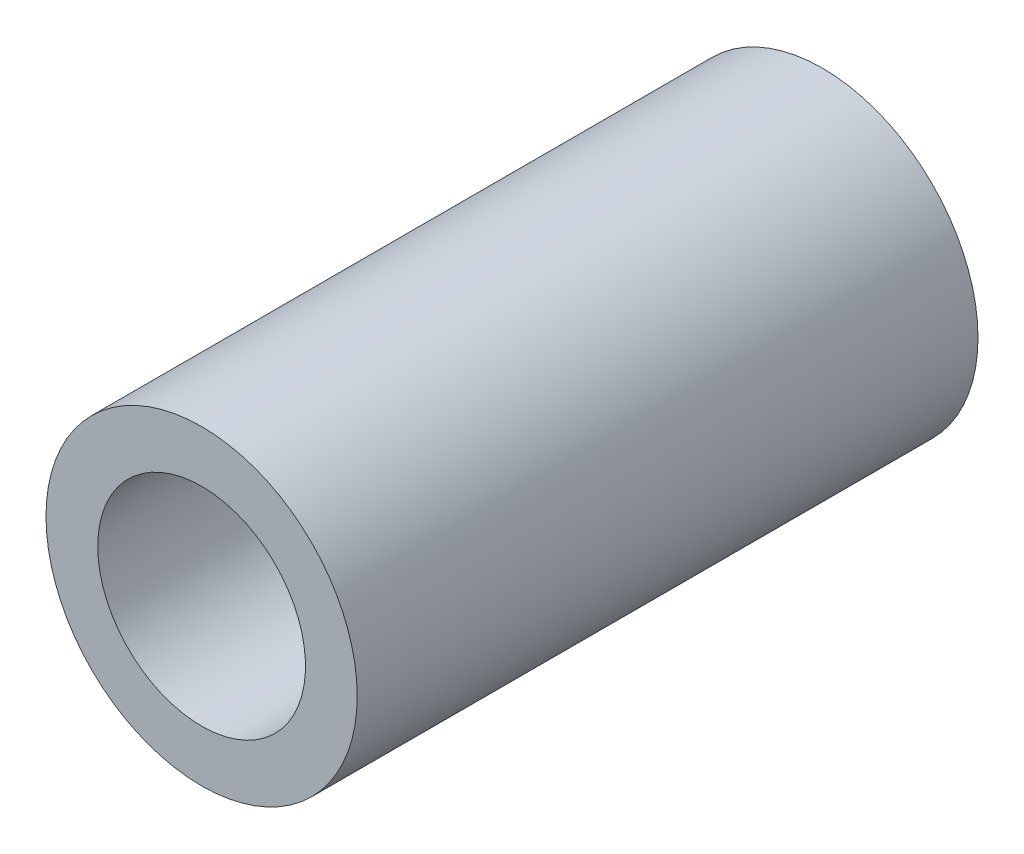
ISO-10303-21;
HEADER;
FILE_DESCRIPTION(('STEP AP214'),'2;1');
FILE_NAME('part.step','',(''),(''),'','','');
FILE_SCHEMA(('AUTOMOTIVE_DESIGN { 1 0 10303 214 1 1 1 1 }'));
ENDSEC;
DATA;
#1=APPLICATION_CONTEXT('core data for automotive mechanical design processes');
#2=APPLICATION_PROTOCOL_DEFINITION('international standard','automotive_design',2000,#1);
#3=PRODUCT_CONTEXT('',#1,'mechanical');
#4=PRODUCT('Part','Part','',(#3));
#5=PRODUCT_RELATED_PRODUCT_CATEGORY('part','',(#4));
#6=PRODUCT_DEFINITION_FORMATION('','',#4);
#7=PRODUCT_DEFINITION_CONTEXT('part definition',#1,'design');
#8=PRODUCT_DEFINITION('design','',#6,#7);
#9=PRODUCT_DEFINITION_SHAPE('','',#8);
#10=(LENGTH_UNIT() NAMED_UNIT(*) SI_UNIT(.MILLI.,.METRE.));
#11=(NAMED_UNIT(*) PLANE_ANGLE_UNIT() SI_UNIT($,.RADIAN.));
#12=(NAMED_UNIT(*) SI_UNIT($,.STERADIAN.) SOLID_ANGLE_UNIT());
#13=UNCERTAINTY_MEASURE_WITH_UNIT(LENGTH_MEASURE(1.E-05),#10,'distance_accuracy_value','');
#14=(GEOMETRIC_REPRESENTATION_CONTEXT(3) GLOBAL_UNCERTAINTY_ASSIGNED_CONTEXT((#13)) GLOBAL_UNIT_ASSIGNED_CONTEXT((#10,
#11,#12)) REPRESENTATION_CONTEXT('',''));
#15=CARTESIAN_POINT('',(0.,0.,0.));
#16=DIRECTION('',(0.,0.,1.));
#17=DIRECTION('',(1.,0.,0.));
#18=AXIS2_PLACEMENT_3D('',#15,#16,#17);
#19=CARTESIAN_POINT('',(0.,0.,19.05));
#20=DIRECTION('',(0.,0.,1.));
#21=DIRECTION('',(1.,0.,0.));
#22=AXIS2_PLACEMENT_3D('',#19,#20,#21);
#23=PLANE('',#22);
#24=CARTESIAN_POINT('',(0.,0.,19.05));
#25=DIRECTION('',(0.,0.,1.));
#26=DIRECTION('',(1.,0.,0.));
#27=AXIS2_PLACEMENT_3D('',#24,#25,#26);
#28=CIRCLE('',#27,9.5504);
#29=CARTESIAN_POINT('',(-9.5504,0.,19.05));
#30=VERTEX_POINT('',#29);
#31=EDGE_CURVE('E10',#30,#30,#28,.T.);
#32=ORIENTED_EDGE('',*,*,#31,.T.);
#33=EDGE_LOOP('',(#32));
#34=FACE_BOUND('',#33,.T.);
#35=CARTESIAN_POINT('',(0.,0.,19.05));
#36=DIRECTION('',(0.,0.,1.));
#37=DIRECTION('',(1.,0.,0.));
#38=AXIS2_PLACEMENT_3D('',#35,#36,#37);
#39=CIRCLE('',#38,6.3754);
#40=CARTESIAN_POINT('',(-6.3754,0.,19.05));
#41=VERTEX_POINT('',#40);
#42=EDGE_CURVE('E41',#41,#41,#39,.T.);
#43=ORIENTED_EDGE('',*,*,#42,.F.);
#44=EDGE_LOOP('',(#43));
#45=FACE_BOUND('',#44,.T.);
#46=ADVANCED_FACE('F30',(#34,#45),#23,.T.);
#47=CARTESIAN_POINT('',(0.,0.,-19.05));
#48=DIRECTION('',(0.,0.,1.));
#49=DIRECTION('',(1.,0.,0.));
#50=AXIS2_PLACEMENT_3D('',#47,#48,#49);
#51=PLANE('',#50);
#52=CARTESIAN_POINT('',(0.,0.,-19.05));
#53=DIRECTION('',(0.,0.,1.));
#54=DIRECTION('',(1.,0.,0.));
#55=AXIS2_PLACEMENT_3D('',#52,#53,#54);
#56=CIRCLE('',#55,9.5504);
#57=CARTESIAN_POINT('',(-9.5504,0.,-19.05));
#58=VERTEX_POINT('',#57);
#59=EDGE_CURVE('E34',#58,#58,#56,.T.);
#60=ORIENTED_EDGE('',*,*,#59,.F.);
#61=EDGE_LOOP('',(#60));
#62=FACE_BOUND('',#61,.T.);
#63=CARTESIAN_POINT('',(0.,0.,-19.05));
#64=DIRECTION('',(0.,0.,1.));
#65=DIRECTION('',(1.,0.,0.));
#66=AXIS2_PLACEMENT_3D('',#63,#64,#65);
#67=CIRCLE('',#66,6.3754);
#68=CARTESIAN_POINT('',(-6.3754,0.,-19.05));
#69=VERTEX_POINT('',#68);
#70=EDGE_CURVE('E43',#69,#69,#67,.T.);
#71=ORIENTED_EDGE('',*,*,#70,.T.);
#72=EDGE_LOOP('',(#71));
#73=FACE_BOUND('',#72,.T.);
#74=ADVANCED_FACE('F53',(#62,#73),#51,.F.);
#75=CARTESIAN_POINT('',(0.,0.,19.05));
#76=DIRECTION('',(0.,0.,-1.));
#77=DIRECTION('',(-1.,0.,0.));
#78=AXIS2_PLACEMENT_3D('',#75,#76,#77);
#79=CYLINDRICAL_SURFACE('',#78,9.5504);
#80=CARTESIAN_POINT('',(-9.5504,0.,19.05));
#81=CARTESIAN_POINT('',(-9.5504,0.,18.653125));
#82=CARTESIAN_POINT('',(-9.5504,0.,18.25625));
#83=CARTESIAN_POINT('',(-9.5504,0.,17.4625));
#84=CARTESIAN_POINT('',(-9.5504,0.,17.065625));
#85=CARTESIAN_POINT('',(-9.5504,0.,16.271875));
#86=CARTESIAN_POINT('',(-9.5504,0.,15.875));
#87=CARTESIAN_POINT('',(-9.5504,0.,15.08125));
#88=CARTESIAN_POINT('',(-9.5504,0.,14.684375));
#89=CARTESIAN_POINT('',(-9.5504,0.,13.890625));
#90=CARTESIAN_POINT('',(-9.5504,0.,13.49375));
#91=CARTESIAN_POINT('',(-9.5504,0.,12.7));
#92=CARTESIAN_POINT('',(-9.5504,0.,12.303125));
#93=CARTESIAN_POINT('',(-9.5504,0.,11.509375));
#94=CARTESIAN_POINT('',(-9.5504,0.,11.1125));
#95=CARTESIAN_POINT('',(-9.5504,0.,10.31875));
#96=CARTESIAN_POINT('',(-9.5504,0.,9.921875));
#97=CARTESIAN_POINT('',(-9.5504,0.,9.128125));
#98=CARTESIAN_POINT('',(-9.5504,0.,8.73125));
#99=CARTESIAN_POINT('',(-9.5504,0.,7.9375));
#100=CARTESIAN_POINT('',(-9.5504,0.,7.540625));
#101=CARTESIAN_POINT('',(-9.5504,0.,6.746875));
#102=CARTESIAN_POINT('',(-9.5504,0.,6.35));
#103=CARTESIAN_POINT('',(-9.5504,0.,5.55625));
#104=CARTESIAN_POINT('',(-9.5504,0.,5.159375));
#105=CARTESIAN_POINT('',(-9.5504,0.,4.365625));
#106=CARTESIAN_POINT('',(-9.5504,0.,3.96875));
#107=CARTESIAN_POINT('',(-9.5504,0.,3.175));
#108=CARTESIAN_POINT('',(-9.5504,0.,2.778125));
#109=CARTESIAN_POINT('',(-9.5504,0.,1.984375));
#110=CARTESIAN_POINT('',(-9.5504,0.,1.5875));
#111=CARTESIAN_POINT('',(-9.5504,0.,0.79375));
#112=CARTESIAN_POINT('',(-9.5504,0.,0.396875));
#113=CARTESIAN_POINT('',(-9.5504,0.,-0.396875));
#114=CARTESIAN_POINT('',(-9.5504,0.,-0.79375));
#115=CARTESIAN_POINT('',(-9.5504,0.,-1.5875));
#116=CARTESIAN_POINT('',(-9.5504,0.,-1.984375));
#117=CARTESIAN_POINT('',(-9.5504,0.,-2.778125));
#118=CARTESIAN_POINT('',(-9.5504,0.,-3.175));
#119=CARTESIAN_POINT('',(-9.5504,0.,-3.96875));
#120=CARTESIAN_POINT('',(-9.5504,0.,-4.365625));
#121=CARTESIAN_POINT('',(-9.5504,0.,-5.159375));
#122=CARTESIAN_POINT('',(-9.5504,0.,-5.55625));
#123=CARTESIAN_POINT('',(-9.5504,0.,-6.35));
#124=CARTESIAN_POINT('',(-9.5504,0.,-6.746875));
#125=CARTESIAN_POINT('',(-9.5504,0.,-7.540625));
#126=CARTESIAN_POINT('',(-9.5504,0.,-7.9375));
#127=CARTESIAN_POINT('',(-9.5504,0.,-8.73125));
#128=CARTESIAN_POINT('',(-9.5504,0.,-9.128125));
#129=CARTESIAN_POINT('',(-9.5504,0.,-9.921875));
#130=CARTESIAN_POINT('',(-9.5504,0.,-10.31875));
#131=CARTESIAN_POINT('',(-9.5504,0.,-11.1125));
#132=CARTESIAN_POINT('',(-9.5504,0.,-11.509375));
#133=CARTESIAN_POINT('',(-9.5504,0.,-12.303125));
#134=CARTESIAN_POINT('',(-9.5504,0.,-12.7));
#135=CARTESIAN_POINT('',(-9.5504,0.,-13.49375));
#136=CARTESIAN_POINT('',(-9.5504,0.,-13.890625));
#137=CARTESIAN_POINT('',(-9.5504,0.,-14.684375));
#138=CARTESIAN_POINT('',(-9.5504,0.,-15.08125));
#139=CARTESIAN_POINT('',(-9.5504,0.,-15.875));
#140=CARTESIAN_POINT('',(-9.5504,0.,-16.271875));
#141=CARTESIAN_POINT('',(-9.5504,0.,-17.065625));
#142=CARTESIAN_POINT('',(-9.5504,0.,-17.4625));
#143=CARTESIAN_POINT('',(-9.5504,0.,-18.25625));
#144=CARTESIAN_POINT('',(-9.5504,0.,-18.653125));
#145=CARTESIAN_POINT('',(-9.5504,0.,-19.05));
#146=B_SPLINE_CURVE_WITH_KNOTS('',3,(#80,#81,#82,#83,#84,#85,#86,#87,#88,#89,#90,#91,#92,#93,
#94,#95,#96,#97,#98,#99,#100,#101,#102,#103,#104,#105,#106,#107,#108,#109,#110,#111,#112,#113,
#114,#115,#116,#117,#118,#119,#120,#121,#122,#123,#124,#125,#126,#127,#128,#129,#130,#131,#132,
#133,#134,#135,#136,#137,#138,#139,#140,#141,#142,#143,#144,#145),.UNSPECIFIED.,.F.,.F.,(4,2,2,
2,2,2,2,2,2,2,2,2,2,2,2,2,2,2,2,2,2,2,2,2,2,2,2,2,2,2,2,2,4),(0.,1.190625,2.38125,3.571875,
4.7625,5.953125,7.14375,8.334375,9.525,10.715625,11.90625,13.096875,14.2875,15.478125,16.66875,
17.859375,19.05,20.240625,21.43125,22.621875,23.8125,25.003125,26.19375,27.384375,28.575,
29.765625,30.95625,32.146875,33.3375,34.528125,35.71875,36.909375,38.1),.UNSPECIFIED.);
#147=EDGE_CURVE('BSEAM32',#30,#58,#146,.T.);
#148=ORIENTED_EDGE('',*,*,#31,.F.);
#149=ORIENTED_EDGE('',*,*,#59,.T.);
#150=ORIENTED_EDGE('',*,*,#147,.T.);
#151=ORIENTED_EDGE('',*,*,#147,.F.);
#152=EDGE_LOOP('',(#148,#150,#149,#151));
#153=FACE_BOUND('',#152,.T.);
#154=ADVANCED_FACE('F32',(#153),#79,.T.);
#155=CARTESIAN_POINT('',(0.,0.,19.05));
#156=DIRECTION('',(0.,0.,-1.));
#157=DIRECTION('',(-1.,0.,0.));
#158=AXIS2_PLACEMENT_3D('',#155,#156,#157);
#159=CYLINDRICAL_SURFACE('',#158,6.3754);
#160=CARTESIAN_POINT('',(-6.3754,0.,19.05));
#161=CARTESIAN_POINT('',(-6.3754,0.,18.653125));
#162=CARTESIAN_POINT('',(-6.3754,0.,18.25625));
#163=CARTESIAN_POINT('',(-6.3754,0.,17.4625));
#164=CARTESIAN_POINT('',(-6.3754,0.,17.065625));
#165=CARTESIAN_POINT('',(-6.3754,0.,16.271875));
#166=CARTESIAN_POINT('',(-6.3754,0.,15.875));
#167=CARTESIAN_POINT('',(-6.3754,0.,15.08125));
#168=CARTESIAN_POINT('',(-6.3754,0.,14.684375));
#169=CARTESIAN_POINT('',(-6.3754,0.,13.890625));
#170=CARTESIAN_POINT('',(-6.3754,0.,13.49375));
#171=CARTESIAN_POINT('',(-6.3754,0.,12.7));
#172=CARTESIAN_POINT('',(-6.3754,0.,12.303125));
#173=CARTESIAN_POINT('',(-6.3754,0.,11.509375));
#174=CARTESIAN_POINT('',(-6.3754,0.,11.1125));
#175=CARTESIAN_POINT('',(-6.3754,0.,10.31875));
#176=CARTESIAN_POINT('',(-6.3754,0.,9.921875));
#177=CARTESIAN_POINT('',(-6.3754,0.,9.128125));
#178=CARTESIAN_POINT('',(-6.3754,0.,8.73125));
#179=CARTESIAN_POINT('',(-6.3754,0.,7.9375));
#180=CARTESIAN_POINT('',(-6.3754,0.,7.540625));
#181=CARTESIAN_POINT('',(-6.3754,0.,6.746875));
#182=CARTESIAN_POINT('',(-6.3754,0.,6.35));
#183=CARTESIAN_POINT('',(-6.3754,0.,5.55625));
#184=CARTESIAN_POINT('',(-6.3754,0.,5.159375));
#185=CARTESIAN_POINT('',(-6.3754,0.,4.365625));
#186=CARTESIAN_POINT('',(-6.3754,0.,3.96875));
#187=CARTESIAN_POINT('',(-6.3754,0.,3.175));
#188=CARTESIAN_POINT('',(-6.3754,0.,2.778125));
#189=CARTESIAN_POINT('',(-6.3754,0.,1.984375));
#190=CARTESIAN_POINT('',(-6.3754,0.,1.5875));
#191=CARTESIAN_POINT('',(-6.3754,0.,0.793749999999997));
#192=CARTESIAN_POINT('',(-6.3754,0.,0.396874999999997));
#193=CARTESIAN_POINT('',(-6.3754,0.,-0.396875000000004));
#194=CARTESIAN_POINT('',(-6.3754,0.,-0.793750000000004));
#195=CARTESIAN_POINT('',(-6.3754,0.,-1.5875));
#196=CARTESIAN_POINT('',(-6.3754,0.,-1.984375));
#197=CARTESIAN_POINT('',(-6.3754,0.,-2.77812500000001));
#198=CARTESIAN_POINT('',(-6.3754,0.,-3.17500000000001));
#199=CARTESIAN_POINT('',(-6.3754,0.,-3.96875000000001));
#200=CARTESIAN_POINT('',(-6.3754,0.,-4.36562500000001));
#201=CARTESIAN_POINT('',(-6.3754,0.,-5.15937500000001));
#202=CARTESIAN_POINT('',(-6.3754,0.,-5.55625));
#203=CARTESIAN_POINT('',(-6.3754,0.,-6.35));
#204=CARTESIAN_POINT('',(-6.3754,0.,-6.746875));
#205=CARTESIAN_POINT('',(-6.3754,0.,-7.540625));
#206=CARTESIAN_POINT('',(-6.3754,0.,-7.93750000000001));
#207=CARTESIAN_POINT('',(-6.3754,0.,-8.73125));
#208=CARTESIAN_POINT('',(-6.3754,0.,-9.12812500000001));
#209=CARTESIAN_POINT('',(-6.3754,0.,-9.92187500000001));
#210=CARTESIAN_POINT('',(-6.3754,0.,-10.31875));
#211=CARTESIAN_POINT('',(-6.3754,0.,-11.1125));
#212=CARTESIAN_POINT('',(-6.3754,0.,-11.509375));
#213=CARTESIAN_POINT('',(-6.3754,0.,-12.303125));
#214=CARTESIAN_POINT('',(-6.3754,0.,-12.7));
#215=CARTESIAN_POINT('',(-6.3754,0.,-13.49375));
#216=CARTESIAN_POINT('',(-6.3754,0.,-13.890625));
#217=CARTESIAN_POINT('',(-6.3754,0.,-14.684375));
#218=CARTESIAN_POINT('',(-6.3754,0.,-15.08125));
#219=CARTESIAN_POINT('',(-6.3754,0.,-15.875));
#220=CARTESIAN_POINT('',(-6.3754,0.,-16.271875));
#221=CARTESIAN_POINT('',(-6.3754,0.,-17.065625));
#222=CARTESIAN_POINT('',(-6.3754,0.,-17.4625));
#223=CARTESIAN_POINT('',(-6.3754,0.,-18.25625));
#224=CARTESIAN_POINT('',(-6.3754,0.,-18.653125));
#225=CARTESIAN_POINT('',(-6.3754,0.,-19.05));
#226=B_SPLINE_CURVE_WITH_KNOTS('',3,(#160,#161,#162,#163,#164,#165,#166,#167,#168,#169,#170,
#171,#172,#173,#174,#175,#176,#177,#178,#179,#180,#181,#182,#183,#184,#185,#186,#187,#188,#189,
#190,#191,#192,#193,#194,#195,#196,#197,#198,#199,#200,#201,#202,#203,#204,#205,#206,#207,#208,
#209,#210,#211,#212,#213,#214,#215,#216,#217,#218,#219,#220,#221,#222,#223,#224,#225),
.UNSPECIFIED.,.F.,.F.,(4,2,2,2,2,2,2,2,2,2,2,2,2,2,2,2,2,2,2,2,2,2,2,2,2,2,2,2,2,2,2,2,4),(0.,
1.190625,2.38125,3.571875,4.7625,5.953125,7.14375,8.334375,9.525,10.715625,11.90625,13.096875,
14.2875,15.478125,16.66875,17.859375,19.05,20.240625,21.43125,22.621875,23.8125,25.003125,
26.19375,27.384375,28.575,29.765625,30.95625,32.146875,33.3375,34.528125,35.71875,36.909375,
38.1),.UNSPECIFIED.);
#227=EDGE_CURVE('BSEAM49',#41,#69,#226,.T.);
#228=ORIENTED_EDGE('',*,*,#42,.T.);
#229=ORIENTED_EDGE('',*,*,#70,.F.);
#230=ORIENTED_EDGE('',*,*,#227,.T.);
#231=ORIENTED_EDGE('',*,*,#227,.F.);
#232=EDGE_LOOP('',(#228,#230,#229,#231));
#233=FACE_BOUND('',#232,.T.);
#234=ADVANCED_FACE('F49',(#233),#159,.F.);
#235=CLOSED_SHELL('',(#46,#74,#154,#234));
#236=MANIFOLD_SOLID_BREP('B2',#235);
#237=ADVANCED_BREP_SHAPE_REPRESENTATION('',(#18,#236),#14);
#238=SHAPE_DEFINITION_REPRESENTATION(#9,#237);
ENDSEC;
END-ISO-10303-21;
